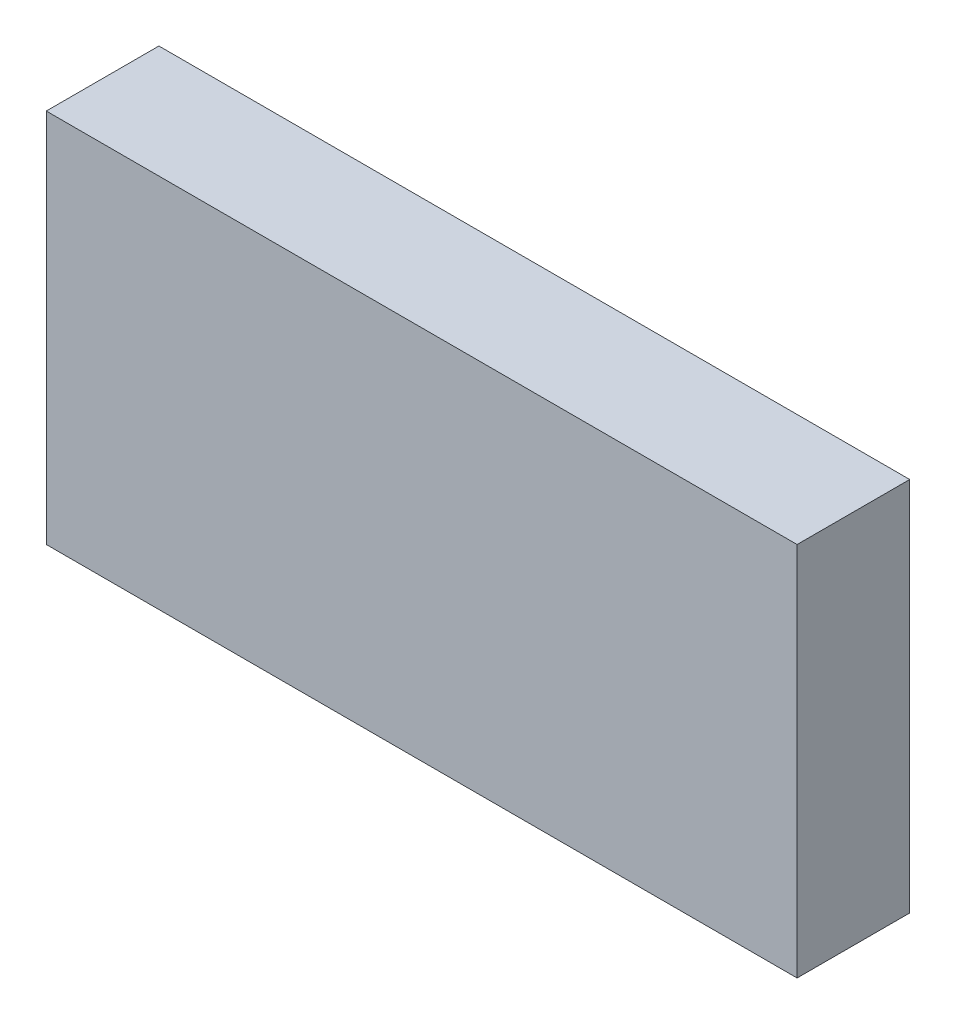
ISO-10303-21;
HEADER;
FILE_DESCRIPTION(('STEP AP214'),'2;1');
FILE_NAME('part.step','',(''),(''),'','','');
FILE_SCHEMA(('AUTOMOTIVE_DESIGN { 1 0 10303 214 1 1 1 1 }'));
ENDSEC;
DATA;
#1=APPLICATION_CONTEXT('core data for automotive mechanical design processes');
#2=APPLICATION_PROTOCOL_DEFINITION('international standard','automotive_design',2000,#1);
#3=PRODUCT_CONTEXT('',#1,'mechanical');
#4=PRODUCT('Part','Part','',(#3));
#5=PRODUCT_RELATED_PRODUCT_CATEGORY('part','',(#4));
#6=PRODUCT_DEFINITION_FORMATION('','',#4);
#7=PRODUCT_DEFINITION_CONTEXT('part definition',#1,'design');
#8=PRODUCT_DEFINITION('design','',#6,#7);
#9=PRODUCT_DEFINITION_SHAPE('','',#8);
#10=(LENGTH_UNIT() NAMED_UNIT(*) SI_UNIT(.MILLI.,.METRE.));
#11=(NAMED_UNIT(*) PLANE_ANGLE_UNIT() SI_UNIT($,.RADIAN.));
#12=(NAMED_UNIT(*) SI_UNIT($,.STERADIAN.) SOLID_ANGLE_UNIT());
#13=UNCERTAINTY_MEASURE_WITH_UNIT(LENGTH_MEASURE(1.E-05),#10,'distance_accuracy_value','');
#14=(GEOMETRIC_REPRESENTATION_CONTEXT(3) GLOBAL_UNCERTAINTY_ASSIGNED_CONTEXT((#13)) GLOBAL_UNIT_ASSIGNED_CONTEXT((#10,
#11,#12)) REPRESENTATION_CONTEXT('',''));
#15=CARTESIAN_POINT('',(0.,0.,0.));
#16=DIRECTION('',(0.,0.,1.));
#17=DIRECTION('',(1.,0.,0.));
#18=AXIS2_PLACEMENT_3D('',#15,#16,#17);
#19=CARTESIAN_POINT('',(0.,0.,150.));
#20=DIRECTION('',(1.,0.,0.));
#21=DIRECTION('',(0.,0.,-1.));
#22=AXIS2_PLACEMENT_3D('',#19,#20,#21);
#23=PLANE('',#22);
#24=DIRECTION('',(0.,-1.,0.));
#25=VECTOR('',#24,1.);
#26=CARTESIAN_POINT('',(0.,0.,0.));
#27=LINE('',#26,#25);
#28=CARTESIAN_POINT('',(0.,500.,0.));
#29=VERTEX_POINT('',#28);
#30=CARTESIAN_POINT('',(0.,0.,0.));
#31=VERTEX_POINT('',#30);
#32=EDGE_CURVE('E96',#29,#31,#27,.T.);
#33=ORIENTED_EDGE('',*,*,#32,.T.);
#34=DIRECTION('',(0.,0.,-1.));
#35=VECTOR('',#34,1.);
#36=CARTESIAN_POINT('',(0.,0.,150.));
#37=LINE('',#36,#35);
#38=CARTESIAN_POINT('',(0.,0.,150.));
#39=VERTEX_POINT('',#38);
#40=EDGE_CURVE('E11',#39,#31,#37,.T.);
#41=ORIENTED_EDGE('',*,*,#40,.F.);
#42=DIRECTION('',(0.,-1.,0.));
#43=VECTOR('',#42,1.);
#44=CARTESIAN_POINT('',(0.,0.,150.));
#45=LINE('',#44,#43);
#46=CARTESIAN_POINT('',(0.,500.,150.));
#47=VERTEX_POINT('',#46);
#48=EDGE_CURVE('E84',#47,#39,#45,.T.);
#49=ORIENTED_EDGE('',*,*,#48,.F.);
#50=DIRECTION('',(0.,0.,-1.));
#51=VECTOR('',#50,1.);
#52=CARTESIAN_POINT('',(0.,500.,150.));
#53=LINE('',#52,#51);
#54=EDGE_CURVE('E92',#47,#29,#53,.T.);
#55=ORIENTED_EDGE('',*,*,#54,.T.);
#56=EDGE_LOOP('',(#33,#41,#49,#55));
#57=FACE_BOUND('',#56,.T.);
#58=ADVANCED_FACE('F33',(#57),#23,.F.);
#59=CARTESIAN_POINT('',(0.,0.,150.));
#60=DIRECTION('',(0.,1.,0.));
#61=DIRECTION('',(0.,0.,1.));
#62=AXIS2_PLACEMENT_3D('',#59,#60,#61);
#63=PLANE('',#62);
#64=DIRECTION('',(1.,0.,0.));
#65=VECTOR('',#64,1.);
#66=CARTESIAN_POINT('',(0.,0.,0.));
#67=LINE('',#66,#65);
#68=CARTESIAN_POINT('',(1000.,0.,0.));
#69=VERTEX_POINT('',#68);
#70=EDGE_CURVE('E88',#31,#69,#67,.T.);
#71=ORIENTED_EDGE('',*,*,#70,.T.);
#72=DIRECTION('',(0.,0.,-1.));
#73=VECTOR('',#72,1.);
#74=CARTESIAN_POINT('',(1000.,0.,150.));
#75=LINE('',#74,#73);
#76=CARTESIAN_POINT('',(1000.,0.,150.));
#77=VERTEX_POINT('',#76);
#78=EDGE_CURVE('E41',#77,#69,#75,.T.);
#79=ORIENTED_EDGE('',*,*,#78,.F.);
#80=DIRECTION('',(1.,0.,0.));
#81=VECTOR('',#80,1.);
#82=CARTESIAN_POINT('',(0.,0.,150.));
#83=LINE('',#82,#81);
#84=EDGE_CURVE('E79',#39,#77,#83,.T.);
#85=ORIENTED_EDGE('',*,*,#84,.F.);
#86=ORIENTED_EDGE('',*,*,#40,.T.);
#87=EDGE_LOOP('',(#71,#79,#85,#86));
#88=FACE_BOUND('',#87,.T.);
#89=ADVANCED_FACE('F87',(#88),#63,.F.);
#90=CARTESIAN_POINT('',(1000.,0.,150.));
#91=DIRECTION('',(-1.,0.,0.));
#92=DIRECTION('',(0.,0.,1.));
#93=AXIS2_PLACEMENT_3D('',#90,#91,#92);
#94=PLANE('',#93);
#95=DIRECTION('',(0.,1.,0.));
#96=VECTOR('',#95,1.);
#97=CARTESIAN_POINT('',(1000.,0.,0.));
#98=LINE('',#97,#96);
#99=CARTESIAN_POINT('',(1000.,500.,0.));
#100=VERTEX_POINT('',#99);
#101=EDGE_CURVE('E66',#69,#100,#98,.T.);
#102=ORIENTED_EDGE('',*,*,#101,.T.);
#103=DIRECTION('',(0.,0.,-1.));
#104=VECTOR('',#103,1.);
#105=CARTESIAN_POINT('',(1000.,500.,150.));
#106=LINE('',#105,#104);
#107=CARTESIAN_POINT('',(1000.,500.,150.));
#108=VERTEX_POINT('',#107);
#109=EDGE_CURVE('E89',#108,#100,#106,.T.);
#110=ORIENTED_EDGE('',*,*,#109,.F.);
#111=DIRECTION('',(0.,1.,0.));
#112=VECTOR('',#111,1.);
#113=CARTESIAN_POINT('',(1000.,0.,150.));
#114=LINE('',#113,#112);
#115=EDGE_CURVE('E82',#77,#108,#114,.T.);
#116=ORIENTED_EDGE('',*,*,#115,.F.);
#117=ORIENTED_EDGE('',*,*,#78,.T.);
#118=EDGE_LOOP('',(#102,#110,#116,#117));
#119=FACE_BOUND('',#118,.T.);
#120=ADVANCED_FACE('F90',(#119),#94,.F.);
#121=CARTESIAN_POINT('',(0.,500.,150.));
#122=DIRECTION('',(0.,-1.,0.));
#123=DIRECTION('',(0.,0.,-1.));
#124=AXIS2_PLACEMENT_3D('',#121,#122,#123);
#125=PLANE('',#124);
#126=DIRECTION('',(-1.,0.,0.));
#127=VECTOR('',#126,1.);
#128=CARTESIAN_POINT('',(0.,500.,0.));
#129=LINE('',#128,#127);
#130=EDGE_CURVE('E72',#100,#29,#129,.T.);
#131=ORIENTED_EDGE('',*,*,#130,.T.);
#132=ORIENTED_EDGE('',*,*,#54,.F.);
#133=DIRECTION('',(-1.,0.,0.));
#134=VECTOR('',#133,1.);
#135=CARTESIAN_POINT('',(0.,500.,150.));
#136=LINE('',#135,#134);
#137=EDGE_CURVE('E49',#108,#47,#136,.T.);
#138=ORIENTED_EDGE('',*,*,#137,.F.);
#139=ORIENTED_EDGE('',*,*,#109,.T.);
#140=EDGE_LOOP('',(#131,#132,#138,#139));
#141=FACE_BOUND('',#140,.T.);
#142=ADVANCED_FACE('F103',(#141),#125,.F.);
#143=CARTESIAN_POINT('',(0.,0.,150.));
#144=DIRECTION('',(0.,0.,-1.));
#145=DIRECTION('',(-1.,0.,0.));
#146=AXIS2_PLACEMENT_3D('',#143,#144,#145);
#147=PLANE('',#146);
#148=ORIENTED_EDGE('',*,*,#48,.T.);
#149=ORIENTED_EDGE('',*,*,#84,.T.);
#150=ORIENTED_EDGE('',*,*,#115,.T.);
#151=ORIENTED_EDGE('',*,*,#137,.T.);
#152=EDGE_LOOP('',(#148,#149,#150,#151));
#153=FACE_BOUND('',#152,.T.);
#154=ADVANCED_FACE('F80',(#153),#147,.F.);
#155=CARTESIAN_POINT('',(0.,0.,0.));
#156=DIRECTION('',(0.,0.,-1.));
#157=DIRECTION('',(-1.,0.,0.));
#158=AXIS2_PLACEMENT_3D('',#155,#156,#157);
#159=PLANE('',#158);
#160=ORIENTED_EDGE('',*,*,#32,.F.);
#161=ORIENTED_EDGE('',*,*,#130,.F.);
#162=ORIENTED_EDGE('',*,*,#101,.F.);
#163=ORIENTED_EDGE('',*,*,#70,.F.);
#164=EDGE_LOOP('',(#160,#161,#162,#163));
#165=FACE_BOUND('',#164,.T.);
#166=ADVANCED_FACE('F106',(#165),#159,.T.);
#167=CLOSED_SHELL('',(#58,#89,#120,#142,#154,#166));
#168=MANIFOLD_SOLID_BREP('B2',#167);
#169=ADVANCED_BREP_SHAPE_REPRESENTATION('',(#18,#168),#14);
#170=SHAPE_DEFINITION_REPRESENTATION(#9,#169);
ENDSEC;
END-ISO-10303-21;
